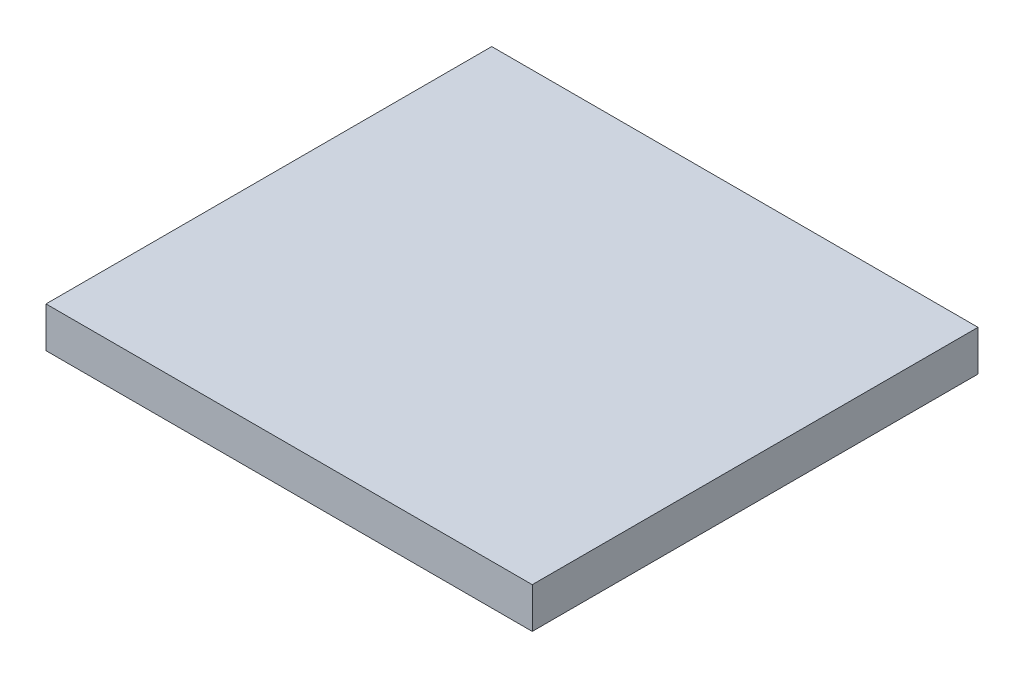
ISO-10303-21;
HEADER;
FILE_DESCRIPTION(('STEP AP214'),'2;1');
FILE_NAME('part.step','',(''),(''),'','','');
FILE_SCHEMA(('AUTOMOTIVE_DESIGN { 1 0 10303 214 1 1 1 1 }'));
ENDSEC;
DATA;
#1=APPLICATION_CONTEXT('core data for automotive mechanical design processes');
#2=APPLICATION_PROTOCOL_DEFINITION('international standard','automotive_design',2000,#1);
#3=PRODUCT_CONTEXT('',#1,'mechanical');
#4=PRODUCT('Part','Part','',(#3));
#5=PRODUCT_RELATED_PRODUCT_CATEGORY('part','',(#4));
#6=PRODUCT_DEFINITION_FORMATION('','',#4);
#7=PRODUCT_DEFINITION_CONTEXT('part definition',#1,'design');
#8=PRODUCT_DEFINITION('design','',#6,#7);
#9=PRODUCT_DEFINITION_SHAPE('','',#8);
#10=(LENGTH_UNIT() NAMED_UNIT(*) SI_UNIT(.MILLI.,.METRE.));
#11=(NAMED_UNIT(*) PLANE_ANGLE_UNIT() SI_UNIT($,.RADIAN.));
#12=(NAMED_UNIT(*) SI_UNIT($,.STERADIAN.) SOLID_ANGLE_UNIT());
#13=UNCERTAINTY_MEASURE_WITH_UNIT(LENGTH_MEASURE(1.E-05),#10,'distance_accuracy_value','');
#14=(GEOMETRIC_REPRESENTATION_CONTEXT(3) GLOBAL_UNCERTAINTY_ASSIGNED_CONTEXT((#13)) GLOBAL_UNIT_ASSIGNED_CONTEXT((#10,
#11,#12)) REPRESENTATION_CONTEXT('',''));
#15=CARTESIAN_POINT('',(0.,0.,0.));
#16=DIRECTION('',(0.,0.,1.));
#17=DIRECTION('',(1.,0.,0.));
#18=AXIS2_PLACEMENT_3D('',#15,#16,#17);
#19=CARTESIAN_POINT('',(120.,20.,110.));
#20=DIRECTION('',(-1.,0.,0.));
#21=DIRECTION('',(0.,0.,1.));
#22=AXIS2_PLACEMENT_3D('',#19,#20,#21);
#23=PLANE('',#22);
#24=DIRECTION('',(0.,0.,-1.));
#25=VECTOR('',#24,1.);
#26=CARTESIAN_POINT('',(120.,0.,110.));
#27=LINE('',#26,#25);
#28=CARTESIAN_POINT('',(120.,0.,110.));
#29=VERTEX_POINT('',#28);
#30=CARTESIAN_POINT('',(120.,0.,-110.));
#31=VERTEX_POINT('',#30);
#32=EDGE_CURVE('E80',#29,#31,#27,.T.);
#33=ORIENTED_EDGE('',*,*,#32,.T.);
#34=DIRECTION('',(0.,-1.,0.));
#35=VECTOR('',#34,1.);
#36=CARTESIAN_POINT('',(120.,20.,-110.));
#37=LINE('',#36,#35);
#38=CARTESIAN_POINT('',(120.,20.,-110.));
#39=VERTEX_POINT('',#38);
#40=EDGE_CURVE('E11',#39,#31,#37,.T.);
#41=ORIENTED_EDGE('',*,*,#40,.F.);
#42=DIRECTION('',(0.,0.,-1.));
#43=VECTOR('',#42,1.);
#44=CARTESIAN_POINT('',(120.,20.,110.));
#45=LINE('',#44,#43);
#46=CARTESIAN_POINT('',(120.,20.,110.));
#47=VERTEX_POINT('',#46);
#48=EDGE_CURVE('E68',#47,#39,#45,.T.);
#49=ORIENTED_EDGE('',*,*,#48,.F.);
#50=DIRECTION('',(0.,-1.,0.));
#51=VECTOR('',#50,1.);
#52=CARTESIAN_POINT('',(120.,20.,110.));
#53=LINE('',#52,#51);
#54=EDGE_CURVE('E76',#47,#29,#53,.T.);
#55=ORIENTED_EDGE('',*,*,#54,.T.);
#56=EDGE_LOOP('',(#33,#41,#49,#55));
#57=FACE_BOUND('',#56,.T.);
#58=ADVANCED_FACE('F17',(#57),#23,.F.);
#59=CARTESIAN_POINT('',(-120.,20.,-110.));
#60=DIRECTION('',(0.,0.,1.));
#61=DIRECTION('',(1.,0.,0.));
#62=AXIS2_PLACEMENT_3D('',#59,#60,#61);
#63=PLANE('',#62);
#64=DIRECTION('',(-1.,0.,0.));
#65=VECTOR('',#64,1.);
#66=CARTESIAN_POINT('',(-120.,0.,-110.));
#67=LINE('',#66,#65);
#68=CARTESIAN_POINT('',(-120.,0.,-110.));
#69=VERTEX_POINT('',#68);
#70=EDGE_CURVE('E72',#31,#69,#67,.T.);
#71=ORIENTED_EDGE('',*,*,#70,.T.);
#72=DIRECTION('',(0.,-1.,0.));
#73=VECTOR('',#72,1.);
#74=CARTESIAN_POINT('',(-120.,20.,-110.));
#75=LINE('',#74,#73);
#76=CARTESIAN_POINT('',(-120.,20.,-110.));
#77=VERTEX_POINT('',#76);
#78=EDGE_CURVE('E25',#77,#69,#75,.T.);
#79=ORIENTED_EDGE('',*,*,#78,.F.);
#80=DIRECTION('',(-1.,0.,0.));
#81=VECTOR('',#80,1.);
#82=CARTESIAN_POINT('',(-120.,20.,-110.));
#83=LINE('',#82,#81);
#84=EDGE_CURVE('E63',#39,#77,#83,.T.);
#85=ORIENTED_EDGE('',*,*,#84,.F.);
#86=ORIENTED_EDGE('',*,*,#40,.T.);
#87=EDGE_LOOP('',(#71,#79,#85,#86));
#88=FACE_BOUND('',#87,.T.);
#89=ADVANCED_FACE('F71',(#88),#63,.F.);
#90=CARTESIAN_POINT('',(-120.,20.,110.));
#91=DIRECTION('',(1.,0.,0.));
#92=DIRECTION('',(0.,0.,-1.));
#93=AXIS2_PLACEMENT_3D('',#90,#91,#92);
#94=PLANE('',#93);
#95=DIRECTION('',(0.,0.,1.));
#96=VECTOR('',#95,1.);
#97=CARTESIAN_POINT('',(-120.,0.,110.));
#98=LINE('',#97,#96);
#99=CARTESIAN_POINT('',(-120.,0.,110.));
#100=VERTEX_POINT('',#99);
#101=EDGE_CURVE('E50',#69,#100,#98,.T.);
#102=ORIENTED_EDGE('',*,*,#101,.T.);
#103=DIRECTION('',(0.,-1.,0.));
#104=VECTOR('',#103,1.);
#105=CARTESIAN_POINT('',(-120.,20.,110.));
#106=LINE('',#105,#104);
#107=CARTESIAN_POINT('',(-120.,20.,110.));
#108=VERTEX_POINT('',#107);
#109=EDGE_CURVE('E73',#108,#100,#106,.T.);
#110=ORIENTED_EDGE('',*,*,#109,.F.);
#111=DIRECTION('',(0.,0.,1.));
#112=VECTOR('',#111,1.);
#113=CARTESIAN_POINT('',(-120.,20.,110.));
#114=LINE('',#113,#112);
#115=EDGE_CURVE('E66',#77,#108,#114,.T.);
#116=ORIENTED_EDGE('',*,*,#115,.F.);
#117=ORIENTED_EDGE('',*,*,#78,.T.);
#118=EDGE_LOOP('',(#102,#110,#116,#117));
#119=FACE_BOUND('',#118,.T.);
#120=ADVANCED_FACE('F74',(#119),#94,.F.);
#121=CARTESIAN_POINT('',(-120.,20.,110.));
#122=DIRECTION('',(0.,0.,-1.));
#123=DIRECTION('',(-1.,0.,0.));
#124=AXIS2_PLACEMENT_3D('',#121,#122,#123);
#125=PLANE('',#124);
#126=DIRECTION('',(1.,0.,0.));
#127=VECTOR('',#126,1.);
#128=CARTESIAN_POINT('',(-120.,0.,110.));
#129=LINE('',#128,#127);
#130=EDGE_CURVE('E56',#100,#29,#129,.T.);
#131=ORIENTED_EDGE('',*,*,#130,.T.);
#132=ORIENTED_EDGE('',*,*,#54,.F.);
#133=DIRECTION('',(1.,0.,0.));
#134=VECTOR('',#133,1.);
#135=CARTESIAN_POINT('',(-120.,20.,110.));
#136=LINE('',#135,#134);
#137=EDGE_CURVE('E33',#108,#47,#136,.T.);
#138=ORIENTED_EDGE('',*,*,#137,.F.);
#139=ORIENTED_EDGE('',*,*,#109,.T.);
#140=EDGE_LOOP('',(#131,#132,#138,#139));
#141=FACE_BOUND('',#140,.T.);
#142=ADVANCED_FACE('F87',(#141),#125,.F.);
#143=CARTESIAN_POINT('',(0.,20.,0.));
#144=DIRECTION('',(0.,-1.,0.));
#145=DIRECTION('',(0.,0.,-1.));
#146=AXIS2_PLACEMENT_3D('',#143,#144,#145);
#147=PLANE('',#146);
#148=ORIENTED_EDGE('',*,*,#48,.T.);
#149=ORIENTED_EDGE('',*,*,#84,.T.);
#150=ORIENTED_EDGE('',*,*,#115,.T.);
#151=ORIENTED_EDGE('',*,*,#137,.T.);
#152=EDGE_LOOP('',(#148,#149,#150,#151));
#153=FACE_BOUND('',#152,.T.);
#154=ADVANCED_FACE('F64',(#153),#147,.F.);
#155=CARTESIAN_POINT('',(0.,0.,0.));
#156=DIRECTION('',(0.,-1.,0.));
#157=DIRECTION('',(0.,0.,-1.));
#158=AXIS2_PLACEMENT_3D('',#155,#156,#157);
#159=PLANE('',#158);
#160=ORIENTED_EDGE('',*,*,#32,.F.);
#161=ORIENTED_EDGE('',*,*,#130,.F.);
#162=ORIENTED_EDGE('',*,*,#101,.F.);
#163=ORIENTED_EDGE('',*,*,#70,.F.);
#164=EDGE_LOOP('',(#160,#161,#162,#163));
#165=FACE_BOUND('',#164,.T.);
#166=ADVANCED_FACE('F90',(#165),#159,.T.);
#167=CLOSED_SHELL('',(#58,#89,#120,#142,#154,#166));
#168=MANIFOLD_SOLID_BREP('B1',#167);
#169=ADVANCED_BREP_SHAPE_REPRESENTATION('',(#18,#168),#14);
#170=SHAPE_DEFINITION_REPRESENTATION(#9,#169);
ENDSEC;
END-ISO-10303-21;
